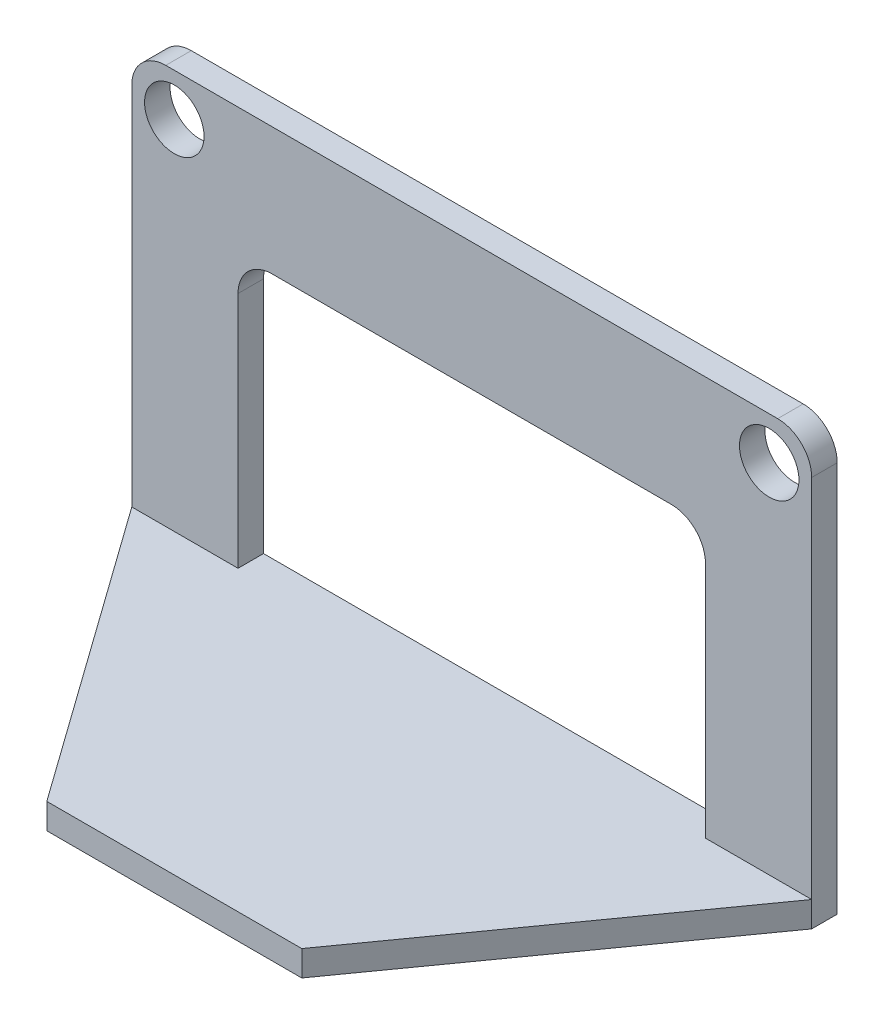
ISO-10303-21;
HEADER;
FILE_DESCRIPTION(('STEP AP214'),'2;1');
FILE_NAME('part.step','',(''),(''),'','','');
FILE_SCHEMA(('AUTOMOTIVE_DESIGN { 1 0 10303 214 1 1 1 1 }'));
ENDSEC;
DATA;
#1=APPLICATION_CONTEXT('core data for automotive mechanical design processes');
#2=APPLICATION_PROTOCOL_DEFINITION('international standard','automotive_design',2000,#1);
#3=PRODUCT_CONTEXT('',#1,'mechanical');
#4=PRODUCT('Part','Part','',(#3));
#5=PRODUCT_RELATED_PRODUCT_CATEGORY('part','',(#4));
#6=PRODUCT_DEFINITION_FORMATION('','',#4);
#7=PRODUCT_DEFINITION_CONTEXT('part definition',#1,'design');
#8=PRODUCT_DEFINITION('design','',#6,#7);
#9=PRODUCT_DEFINITION_SHAPE('','',#8);
#10=(LENGTH_UNIT() NAMED_UNIT(*) SI_UNIT(.MILLI.,.METRE.));
#11=(NAMED_UNIT(*) PLANE_ANGLE_UNIT() SI_UNIT($,.RADIAN.));
#12=(NAMED_UNIT(*) SI_UNIT($,.STERADIAN.) SOLID_ANGLE_UNIT());
#13=UNCERTAINTY_MEASURE_WITH_UNIT(LENGTH_MEASURE(1.E-05),#10,'distance_accuracy_value','');
#14=(GEOMETRIC_REPRESENTATION_CONTEXT(3) GLOBAL_UNCERTAINTY_ASSIGNED_CONTEXT((#13)) GLOBAL_UNIT_ASSIGNED_CONTEXT((#10,
#11,#12)) REPRESENTATION_CONTEXT('',''));
#15=CARTESIAN_POINT('',(0.,0.,0.));
#16=DIRECTION('',(0.,0.,1.));
#17=DIRECTION('',(1.,0.,0.));
#18=AXIS2_PLACEMENT_3D('',#15,#16,#17);
#19=CARTESIAN_POINT('',(0.,0.,3.));
#20=DIRECTION('',(0.,0.,-1.));
#21=DIRECTION('',(-1.,0.,0.));
#22=AXIS2_PLACEMENT_3D('',#19,#20,#21);
#23=PLANE('',#22);
#24=CARTESIAN_POINT('',(5.,-5.,3.));
#25=DIRECTION('',(0.,0.,1.));
#26=DIRECTION('',(1.,0.,0.));
#27=AXIS2_PLACEMENT_3D('',#24,#25,#26);
#28=CIRCLE('',#27,3.5);
#29=CARTESIAN_POINT('',(8.5,-5.,3.));
#30=VERTEX_POINT('',#29);
#31=EDGE_CURVE('E208',#30,#30,#28,.T.);
#32=ORIENTED_EDGE('',*,*,#31,.F.);
#33=EDGE_LOOP('',(#32));
#34=FACE_BOUND('',#33,.T.);
#35=CARTESIAN_POINT('',(75.,-5.,3.));
#36=DIRECTION('',(0.,0.,1.));
#37=DIRECTION('',(1.,0.,0.));
#38=AXIS2_PLACEMENT_3D('',#35,#36,#37);
#39=CIRCLE('',#38,3.50000000000001);
#40=CARTESIAN_POINT('',(78.5,-5.,3.));
#41=VERTEX_POINT('',#40);
#42=EDGE_CURVE('E201',#41,#41,#39,.T.);
#43=ORIENTED_EDGE('',*,*,#42,.F.);
#44=EDGE_LOOP('',(#43));
#45=FACE_BOUND('',#44,.T.);
#46=DIRECTION('',(-1.,0.,0.));
#47=VECTOR('',#46,1.);
#48=CARTESIAN_POINT('',(0.,-47.,3.));
#49=LINE('',#48,#47);
#50=CARTESIAN_POINT('',(80.,-47.,3.));
#51=VERTEX_POINT('',#50);
#52=CARTESIAN_POINT('',(67.5,-47.,3.));
#53=VERTEX_POINT('',#52);
#54=EDGE_CURVE('E157',#51,#53,#49,.T.);
#55=ORIENTED_EDGE('',*,*,#54,.F.);
#56=DIRECTION('',(0.,1.,0.));
#57=VECTOR('',#56,1.);
#58=CARTESIAN_POINT('',(80.,0.,3.));
#59=LINE('',#58,#57);
#60=CARTESIAN_POINT('',(80.,-4.,3.));
#61=VERTEX_POINT('',#60);
#62=EDGE_CURVE('E143',#51,#61,#59,.T.);
#63=ORIENTED_EDGE('',*,*,#62,.T.);
#64=CARTESIAN_POINT('',(76.,-4.,3.));
#65=DIRECTION('',(0.,0.,-1.));
#66=DIRECTION('',(-1.,0.,0.));
#67=AXIS2_PLACEMENT_3D('',#64,#65,#66);
#68=CIRCLE('',#67,4.);
#69=CARTESIAN_POINT('',(76.,0.,3.));
#70=VERTEX_POINT('',#69);
#71=EDGE_CURVE('E260',#61,#70,#68,.F.);
#72=ORIENTED_EDGE('',*,*,#71,.T.);
#73=DIRECTION('',(-1.,0.,0.));
#74=VECTOR('',#73,1.);
#75=CARTESIAN_POINT('',(0.,0.,3.));
#76=LINE('',#75,#74);
#77=CARTESIAN_POINT('',(4.,0.,3.));
#78=VERTEX_POINT('',#77);
#79=EDGE_CURVE('E171',#70,#78,#76,.T.);
#80=ORIENTED_EDGE('',*,*,#79,.T.);
#81=CARTESIAN_POINT('',(4.,-4.,3.));
#82=DIRECTION('',(0.,0.,-1.));
#83=DIRECTION('',(-1.,0.,0.));
#84=AXIS2_PLACEMENT_3D('',#81,#82,#83);
#85=CIRCLE('',#84,4.);
#86=CARTESIAN_POINT('',(0.,-4.,3.));
#87=VERTEX_POINT('',#86);
#88=EDGE_CURVE('E251',#78,#87,#85,.F.);
#89=ORIENTED_EDGE('',*,*,#88,.T.);
#90=DIRECTION('',(0.,-1.,0.));
#91=VECTOR('',#90,1.);
#92=CARTESIAN_POINT('',(0.,-50.,3.));
#93=LINE('',#92,#91);
#94=CARTESIAN_POINT('',(0.,-47.,3.));
#95=VERTEX_POINT('',#94);
#96=EDGE_CURVE('E214',#87,#95,#93,.T.);
#97=ORIENTED_EDGE('',*,*,#96,.T.);
#98=CARTESIAN_POINT('',(12.5,-47.,3.));
#99=VERTEX_POINT('',#98);
#100=EDGE_CURVE('E58',#99,#95,#49,.T.);
#101=ORIENTED_EDGE('',*,*,#100,.F.);
#102=DIRECTION('',(0.,1.,0.));
#103=VECTOR('',#102,1.);
#104=CARTESIAN_POINT('',(12.5,-50.,3.));
#105=LINE('',#104,#103);
#106=CARTESIAN_POINT('',(12.5,-19.,3.));
#107=VERTEX_POINT('',#106);
#108=EDGE_CURVE('E216',#99,#107,#105,.T.);
#109=ORIENTED_EDGE('',*,*,#108,.T.);
#110=CARTESIAN_POINT('',(16.5,-19.,3.));
#111=DIRECTION('',(0.,0.,-1.));
#112=DIRECTION('',(-1.,0.,0.));
#113=AXIS2_PLACEMENT_3D('',#110,#111,#112);
#114=CIRCLE('',#113,4.);
#115=CARTESIAN_POINT('',(16.5,-15.,3.));
#116=VERTEX_POINT('',#115);
#117=EDGE_CURVE('E270',#116,#107,#114,.F.);
#118=ORIENTED_EDGE('',*,*,#117,.F.);
#119=DIRECTION('',(1.,0.,0.));
#120=VECTOR('',#119,1.);
#121=CARTESIAN_POINT('',(12.5,-15.,3.));
#122=LINE('',#121,#120);
#123=CARTESIAN_POINT('',(63.5,-15.,3.));
#124=VERTEX_POINT('',#123);
#125=EDGE_CURVE('E219',#116,#124,#122,.T.);
#126=ORIENTED_EDGE('',*,*,#125,.T.);
#127=CARTESIAN_POINT('',(63.5,-19.,3.));
#128=DIRECTION('',(0.,0.,-1.));
#129=DIRECTION('',(-1.,0.,0.));
#130=AXIS2_PLACEMENT_3D('',#127,#128,#129);
#131=CIRCLE('',#130,4.);
#132=CARTESIAN_POINT('',(67.5,-19.,3.));
#133=VERTEX_POINT('',#132);
#134=EDGE_CURVE('E12',#133,#124,#131,.F.);
#135=ORIENTED_EDGE('',*,*,#134,.F.);
#136=DIRECTION('',(0.,-1.,0.));
#137=VECTOR('',#136,1.);
#138=CARTESIAN_POINT('',(67.5,-15.,3.));
#139=LINE('',#138,#137);
#140=EDGE_CURVE('E153',#133,#53,#139,.T.);
#141=ORIENTED_EDGE('',*,*,#140,.T.);
#142=EDGE_LOOP('',(#55,#63,#72,#80,#89,#97,#101,#109,#118,#126,#135,#141));
#143=FACE_BOUND('',#142,.T.);
#144=ADVANCED_FACE('F36',(#34,#45,#143),#23,.F.);
#145=CARTESIAN_POINT('',(12.5,-50.,3.));
#146=DIRECTION('',(-1.,0.,0.));
#147=DIRECTION('',(0.,0.,1.));
#148=AXIS2_PLACEMENT_3D('',#145,#146,#147);
#149=PLANE('',#148);
#150=DIRECTION('',(0.,0.,1.));
#151=VECTOR('',#150,1.);
#152=CARTESIAN_POINT('',(12.5,-47.,3.));
#153=LINE('',#152,#151);
#154=CARTESIAN_POINT('',(12.5,-47.,0.));
#155=VERTEX_POINT('',#154);
#156=EDGE_CURVE('E162',#155,#99,#153,.T.);
#157=ORIENTED_EDGE('',*,*,#156,.F.);
#158=DIRECTION('',(0.,1.,0.));
#159=VECTOR('',#158,1.);
#160=CARTESIAN_POINT('',(12.5,-50.,0.));
#161=LINE('',#160,#159);
#162=CARTESIAN_POINT('',(12.5,-19.,0.));
#163=VERTEX_POINT('',#162);
#164=EDGE_CURVE('E226',#155,#163,#161,.T.);
#165=ORIENTED_EDGE('',*,*,#164,.T.);
#166=DIRECTION('',(0.,0.,1.));
#167=VECTOR('',#166,1.);
#168=CARTESIAN_POINT('',(12.5,-19.,3.));
#169=LINE('',#168,#167);
#170=EDGE_CURVE('E262',#163,#107,#169,.T.);
#171=ORIENTED_EDGE('',*,*,#170,.T.);
#172=ORIENTED_EDGE('',*,*,#108,.F.);
#173=EDGE_LOOP('',(#157,#165,#171,#172));
#174=FACE_BOUND('',#173,.T.);
#175=ADVANCED_FACE('F292',(#174),#149,.F.);
#176=CARTESIAN_POINT('',(67.5,-15.,3.));
#177=DIRECTION('',(1.,0.,0.));
#178=DIRECTION('',(0.,0.,-1.));
#179=AXIS2_PLACEMENT_3D('',#176,#177,#178);
#180=PLANE('',#179);
#181=DIRECTION('',(0.,0.,-1.));
#182=VECTOR('',#181,1.);
#183=CARTESIAN_POINT('',(67.5,-47.,3.));
#184=LINE('',#183,#182);
#185=CARTESIAN_POINT('',(67.5,-47.,0.));
#186=VERTEX_POINT('',#185);
#187=EDGE_CURVE('E163',#53,#186,#184,.T.);
#188=ORIENTED_EDGE('',*,*,#187,.F.);
#189=ORIENTED_EDGE('',*,*,#140,.F.);
#190=DIRECTION('',(0.,0.,1.));
#191=VECTOR('',#190,1.);
#192=CARTESIAN_POINT('',(67.5,-19.,3.));
#193=LINE('',#192,#191);
#194=CARTESIAN_POINT('',(67.5,-19.,0.));
#195=VERTEX_POINT('',#194);
#196=EDGE_CURVE('E276',#133,#195,#193,.F.);
#197=ORIENTED_EDGE('',*,*,#196,.T.);
#198=DIRECTION('',(0.,-1.,0.));
#199=VECTOR('',#198,1.);
#200=CARTESIAN_POINT('',(67.5,-15.,0.));
#201=LINE('',#200,#199);
#202=EDGE_CURVE('E231',#195,#186,#201,.T.);
#203=ORIENTED_EDGE('',*,*,#202,.T.);
#204=EDGE_LOOP('',(#188,#189,#197,#203));
#205=FACE_BOUND('',#204,.T.);
#206=ADVANCED_FACE('F285',(#205),#180,.F.);
#207=CARTESIAN_POINT('',(63.5,-19.,3.));
#208=DIRECTION('',(0.,0.,-1.));
#209=DIRECTION('',(-1.,0.,0.));
#210=AXIS2_PLACEMENT_3D('',#207,#208,#209);
#211=CYLINDRICAL_SURFACE('',#210,4.);
#212=DIRECTION('',(0.,0.,1.));
#213=VECTOR('',#212,1.);
#214=CARTESIAN_POINT('',(63.5,-15.,3.));
#215=LINE('',#214,#213);
#216=CARTESIAN_POINT('',(63.5,-15.,0.));
#217=VERTEX_POINT('',#216);
#218=EDGE_CURVE('E273',#217,#124,#215,.T.);
#219=ORIENTED_EDGE('',*,*,#218,.F.);
#220=CARTESIAN_POINT('',(63.5,-19.,0.));
#221=DIRECTION('',(0.,0.,-1.));
#222=DIRECTION('',(-1.,0.,0.));
#223=AXIS2_PLACEMENT_3D('',#220,#221,#222);
#224=CIRCLE('',#223,4.);
#225=EDGE_CURVE('E44',#217,#195,#224,.T.);
#226=ORIENTED_EDGE('',*,*,#225,.T.);
#227=ORIENTED_EDGE('',*,*,#196,.F.);
#228=ORIENTED_EDGE('',*,*,#134,.T.);
#229=EDGE_LOOP('',(#219,#226,#227,#228));
#230=FACE_BOUND('',#229,.T.);
#231=ADVANCED_FACE('F38',(#230),#211,.F.);
#232=CARTESIAN_POINT('',(16.5,-19.,3.));
#233=DIRECTION('',(0.,0.,-1.));
#234=DIRECTION('',(-1.,0.,0.));
#235=AXIS2_PLACEMENT_3D('',#232,#233,#234);
#236=CYLINDRICAL_SURFACE('',#235,4.);
#237=ORIENTED_EDGE('',*,*,#170,.F.);
#238=CARTESIAN_POINT('',(16.5,-19.,0.));
#239=DIRECTION('',(0.,0.,-1.));
#240=DIRECTION('',(-1.,0.,0.));
#241=AXIS2_PLACEMENT_3D('',#238,#239,#240);
#242=CIRCLE('',#241,4.);
#243=CARTESIAN_POINT('',(16.5,-15.,0.));
#244=VERTEX_POINT('',#243);
#245=EDGE_CURVE('E268',#163,#244,#242,.T.);
#246=ORIENTED_EDGE('',*,*,#245,.T.);
#247=DIRECTION('',(0.,0.,1.));
#248=VECTOR('',#247,1.);
#249=CARTESIAN_POINT('',(16.5,-15.,3.));
#250=LINE('',#249,#248);
#251=EDGE_CURVE('E265',#116,#244,#250,.F.);
#252=ORIENTED_EDGE('',*,*,#251,.F.);
#253=ORIENTED_EDGE('',*,*,#117,.T.);
#254=EDGE_LOOP('',(#237,#246,#252,#253));
#255=FACE_BOUND('',#254,.T.);
#256=ADVANCED_FACE('F296',(#255),#236,.F.);
#257=CARTESIAN_POINT('',(76.,-4.,3.));
#258=DIRECTION('',(0.,0.,1.));
#259=DIRECTION('',(1.,0.,0.));
#260=AXIS2_PLACEMENT_3D('',#257,#258,#259);
#261=CYLINDRICAL_SURFACE('',#260,4.);
#262=DIRECTION('',(0.,0.,1.));
#263=VECTOR('',#262,1.);
#264=CARTESIAN_POINT('',(80.,-4.,3.));
#265=LINE('',#264,#263);
#266=CARTESIAN_POINT('',(80.,-4.,0.));
#267=VERTEX_POINT('',#266);
#268=EDGE_CURVE('E151',#267,#61,#265,.T.);
#269=ORIENTED_EDGE('',*,*,#268,.F.);
#270=CARTESIAN_POINT('',(76.,-4.,0.));
#271=DIRECTION('',(0.,0.,-1.));
#272=DIRECTION('',(-1.,0.,0.));
#273=AXIS2_PLACEMENT_3D('',#270,#271,#272);
#274=CIRCLE('',#273,4.);
#275=CARTESIAN_POINT('',(76.,0.,0.));
#276=VERTEX_POINT('',#275);
#277=EDGE_CURVE('E257',#276,#267,#274,.T.);
#278=ORIENTED_EDGE('',*,*,#277,.F.);
#279=DIRECTION('',(0.,0.,1.));
#280=VECTOR('',#279,1.);
#281=CARTESIAN_POINT('',(76.,0.,3.));
#282=LINE('',#281,#280);
#283=EDGE_CURVE('E254',#70,#276,#282,.F.);
#284=ORIENTED_EDGE('',*,*,#283,.F.);
#285=ORIENTED_EDGE('',*,*,#71,.F.);
#286=EDGE_LOOP('',(#269,#278,#284,#285));
#287=FACE_BOUND('',#286,.T.);
#288=ADVANCED_FACE('F340',(#287),#261,.T.);
#289=CARTESIAN_POINT('',(4.,-4.,3.));
#290=DIRECTION('',(0.,0.,1.));
#291=DIRECTION('',(1.,0.,0.));
#292=AXIS2_PLACEMENT_3D('',#289,#290,#291);
#293=CYLINDRICAL_SURFACE('',#292,4.);
#294=DIRECTION('',(0.,0.,1.));
#295=VECTOR('',#294,1.);
#296=CARTESIAN_POINT('',(4.,0.,3.));
#297=LINE('',#296,#295);
#298=CARTESIAN_POINT('',(4.,0.,0.));
#299=VERTEX_POINT('',#298);
#300=EDGE_CURVE('E242',#299,#78,#297,.T.);
#301=ORIENTED_EDGE('',*,*,#300,.F.);
#302=CARTESIAN_POINT('',(4.,-4.,0.));
#303=DIRECTION('',(0.,0.,-1.));
#304=DIRECTION('',(-1.,0.,0.));
#305=AXIS2_PLACEMENT_3D('',#302,#303,#304);
#306=CIRCLE('',#305,4.);
#307=CARTESIAN_POINT('',(0.,-4.,0.));
#308=VERTEX_POINT('',#307);
#309=EDGE_CURVE('E248',#308,#299,#306,.T.);
#310=ORIENTED_EDGE('',*,*,#309,.F.);
#311=DIRECTION('',(0.,0.,1.));
#312=VECTOR('',#311,1.);
#313=CARTESIAN_POINT('',(0.,-4.,3.));
#314=LINE('',#313,#312);
#315=EDGE_CURVE('E245',#87,#308,#314,.F.);
#316=ORIENTED_EDGE('',*,*,#315,.F.);
#317=ORIENTED_EDGE('',*,*,#88,.F.);
#318=EDGE_LOOP('',(#301,#310,#316,#317));
#319=FACE_BOUND('',#318,.T.);
#320=ADVANCED_FACE('F327',(#319),#293,.T.);
#321=CARTESIAN_POINT('',(0.,0.,0.));
#322=DIRECTION('',(0.,0.,-1.));
#323=DIRECTION('',(-1.,0.,0.));
#324=AXIS2_PLACEMENT_3D('',#321,#322,#323);
#325=PLANE('',#324);
#326=DIRECTION('',(1.,0.,0.));
#327=VECTOR('',#326,1.);
#328=CARTESIAN_POINT('',(0.,-47.,0.));
#329=LINE('',#328,#327);
#330=EDGE_CURVE('E178',#155,#186,#329,.T.);
#331=ORIENTED_EDGE('',*,*,#330,.T.);
#332=ORIENTED_EDGE('',*,*,#202,.F.);
#333=ORIENTED_EDGE('',*,*,#225,.F.);
#334=DIRECTION('',(1.,0.,0.));
#335=VECTOR('',#334,1.);
#336=CARTESIAN_POINT('',(12.5,-15.,0.));
#337=LINE('',#336,#335);
#338=EDGE_CURVE('E228',#244,#217,#337,.T.);
#339=ORIENTED_EDGE('',*,*,#338,.F.);
#340=ORIENTED_EDGE('',*,*,#245,.F.);
#341=ORIENTED_EDGE('',*,*,#164,.F.);
#342=EDGE_LOOP('',(#331,#332,#333,#339,#340,#341));
#343=FACE_BOUND('',#342,.T.);
#344=DIRECTION('',(1.,0.,0.));
#345=VECTOR('',#344,1.);
#346=CARTESIAN_POINT('',(80.,-50.,0.));
#347=LINE('',#346,#345);
#348=CARTESIAN_POINT('',(0.,-50.,0.));
#349=VERTEX_POINT('',#348);
#350=CARTESIAN_POINT('',(80.,-50.,0.));
#351=VERTEX_POINT('',#350);
#352=EDGE_CURVE('E233',#349,#351,#347,.T.);
#353=ORIENTED_EDGE('',*,*,#352,.F.);
#354=DIRECTION('',(0.,-1.,0.));
#355=VECTOR('',#354,1.);
#356=CARTESIAN_POINT('',(0.,-50.,0.));
#357=LINE('',#356,#355);
#358=EDGE_CURVE('E211',#308,#349,#357,.T.);
#359=ORIENTED_EDGE('',*,*,#358,.F.);
#360=ORIENTED_EDGE('',*,*,#309,.T.);
#361=DIRECTION('',(-1.,0.,0.));
#362=VECTOR('',#361,1.);
#363=CARTESIAN_POINT('',(0.,0.,0.));
#364=LINE('',#363,#362);
#365=EDGE_CURVE('E217',#276,#299,#364,.T.);
#366=ORIENTED_EDGE('',*,*,#365,.F.);
#367=ORIENTED_EDGE('',*,*,#277,.T.);
#368=DIRECTION('',(0.,1.,0.));
#369=VECTOR('',#368,1.);
#370=CARTESIAN_POINT('',(80.,0.,0.));
#371=LINE('',#370,#369);
#372=EDGE_CURVE('E235',#351,#267,#371,.T.);
#373=ORIENTED_EDGE('',*,*,#372,.F.);
#374=EDGE_LOOP('',(#353,#359,#360,#366,#367,#373));
#375=FACE_BOUND('',#374,.T.);
#376=CARTESIAN_POINT('',(5.,-5.,0.));
#377=DIRECTION('',(0.,0.,1.));
#378=DIRECTION('',(1.,0.,0.));
#379=AXIS2_PLACEMENT_3D('',#376,#377,#378);
#380=CIRCLE('',#379,3.5);
#381=CARTESIAN_POINT('',(8.5,-5.,0.));
#382=VERTEX_POINT('',#381);
#383=EDGE_CURVE('E204',#382,#382,#380,.T.);
#384=ORIENTED_EDGE('',*,*,#383,.T.);
#385=EDGE_LOOP('',(#384));
#386=FACE_BOUND('',#385,.T.);
#387=CARTESIAN_POINT('',(75.,-5.,0.));
#388=DIRECTION('',(0.,0.,1.));
#389=DIRECTION('',(1.,0.,0.));
#390=AXIS2_PLACEMENT_3D('',#387,#388,#389);
#391=CIRCLE('',#390,3.50000000000001);
#392=CARTESIAN_POINT('',(78.5,-5.,0.));
#393=VERTEX_POINT('',#392);
#394=EDGE_CURVE('E205',#393,#393,#391,.T.);
#395=ORIENTED_EDGE('',*,*,#394,.T.);
#396=EDGE_LOOP('',(#395));
#397=FACE_BOUND('',#396,.T.);
#398=ADVANCED_FACE('F286',(#343,#375,#386,#397),#325,.T.);
#399=CARTESIAN_POINT('',(0.,-50.,3.));
#400=DIRECTION('',(1.,0.,0.));
#401=DIRECTION('',(0.,0.,-1.));
#402=AXIS2_PLACEMENT_3D('',#399,#400,#401);
#403=PLANE('',#402);
#404=DIRECTION('',(0.,-1.,0.));
#405=VECTOR('',#404,1.);
#406=CARTESIAN_POINT('',(0.,-47.,3.));
#407=LINE('',#406,#405);
#408=CARTESIAN_POINT('',(0.,-50.,3.));
#409=VERTEX_POINT('',#408);
#410=EDGE_CURVE('E51',#95,#409,#407,.T.);
#411=ORIENTED_EDGE('',*,*,#410,.F.);
#412=ORIENTED_EDGE('',*,*,#96,.F.);
#413=ORIENTED_EDGE('',*,*,#315,.T.);
#414=ORIENTED_EDGE('',*,*,#358,.T.);
#415=DIRECTION('',(0.,0.,-1.));
#416=VECTOR('',#415,1.);
#417=CARTESIAN_POINT('',(0.,-50.,3.));
#418=LINE('',#417,#416);
#419=EDGE_CURVE('E239',#409,#349,#418,.T.);
#420=ORIENTED_EDGE('',*,*,#419,.F.);
#421=EDGE_LOOP('',(#411,#412,#413,#414,#420));
#422=FACE_BOUND('',#421,.T.);
#423=ADVANCED_FACE('F302',(#422),#403,.F.);
#424=CARTESIAN_POINT('',(12.5,-15.,3.));
#425=DIRECTION('',(0.,1.,0.));
#426=DIRECTION('',(0.,0.,1.));
#427=AXIS2_PLACEMENT_3D('',#424,#425,#426);
#428=PLANE('',#427);
#429=ORIENTED_EDGE('',*,*,#338,.T.);
#430=ORIENTED_EDGE('',*,*,#218,.T.);
#431=ORIENTED_EDGE('',*,*,#125,.F.);
#432=ORIENTED_EDGE('',*,*,#251,.T.);
#433=EDGE_LOOP('',(#429,#430,#431,#432));
#434=FACE_BOUND('',#433,.T.);
#435=ADVANCED_FACE('F299',(#434),#428,.F.);
#436=CARTESIAN_POINT('',(80.,-50.,3.));
#437=DIRECTION('',(0.,1.,0.));
#438=DIRECTION('',(0.,0.,1.));
#439=AXIS2_PLACEMENT_3D('',#436,#437,#438);
#440=PLANE('',#439);
#441=DIRECTION('',(0.,0.,-1.));
#442=VECTOR('',#441,1.);
#443=CARTESIAN_POINT('',(80.,-50.,3.));
#444=LINE('',#443,#442);
#445=CARTESIAN_POINT('',(80.,-50.,3.));
#446=VERTEX_POINT('',#445);
#447=EDGE_CURVE('E224',#446,#351,#444,.T.);
#448=ORIENTED_EDGE('',*,*,#447,.F.);
#449=DIRECTION('',(-0.581238193719096,0.,0.813733471206735));
#450=VECTOR('',#449,1.);
#451=CARTESIAN_POINT('',(55.,-50.,38.));
#452=LINE('',#451,#450);
#453=CARTESIAN_POINT('',(55.,-50.,38.));
#454=VERTEX_POINT('',#453);
#455=EDGE_CURVE('E170',#446,#454,#452,.T.);
#456=ORIENTED_EDGE('',*,*,#455,.T.);
#457=DIRECTION('',(-1.,0.,0.));
#458=VECTOR('',#457,1.);
#459=CARTESIAN_POINT('',(25.,-50.,38.));
#460=LINE('',#459,#458);
#461=CARTESIAN_POINT('',(25.,-50.,38.));
#462=VERTEX_POINT('',#461);
#463=EDGE_CURVE('E190',#454,#462,#460,.T.);
#464=ORIENTED_EDGE('',*,*,#463,.T.);
#465=DIRECTION('',(-0.581238193719096,0.,-0.813733471206735));
#466=VECTOR('',#465,1.);
#467=CARTESIAN_POINT('',(0.,-50.,3.));
#468=LINE('',#467,#466);
#469=EDGE_CURVE('E183',#462,#409,#468,.T.);
#470=ORIENTED_EDGE('',*,*,#469,.T.);
#471=ORIENTED_EDGE('',*,*,#419,.T.);
#472=ORIENTED_EDGE('',*,*,#352,.T.);
#473=EDGE_LOOP('',(#448,#456,#464,#470,#471,#472));
#474=FACE_BOUND('',#473,.T.);
#475=ADVANCED_FACE('F301',(#474),#440,.F.);
#476=CARTESIAN_POINT('',(80.,0.,3.));
#477=DIRECTION('',(-1.,0.,0.));
#478=DIRECTION('',(0.,0.,1.));
#479=AXIS2_PLACEMENT_3D('',#476,#477,#478);
#480=PLANE('',#479);
#481=ORIENTED_EDGE('',*,*,#372,.T.);
#482=ORIENTED_EDGE('',*,*,#268,.T.);
#483=ORIENTED_EDGE('',*,*,#62,.F.);
#484=EDGE_CURVE('E148',#446,#51,#59,.T.);
#485=ORIENTED_EDGE('',*,*,#484,.F.);
#486=ORIENTED_EDGE('',*,*,#447,.T.);
#487=EDGE_LOOP('',(#481,#482,#483,#485,#486));
#488=FACE_BOUND('',#487,.T.);
#489=ADVANCED_FACE('F145',(#488),#480,.F.);
#490=CARTESIAN_POINT('',(0.,0.,3.));
#491=DIRECTION('',(0.,-1.,0.));
#492=DIRECTION('',(0.,0.,-1.));
#493=AXIS2_PLACEMENT_3D('',#490,#491,#492);
#494=PLANE('',#493);
#495=ORIENTED_EDGE('',*,*,#79,.F.);
#496=ORIENTED_EDGE('',*,*,#283,.T.);
#497=ORIENTED_EDGE('',*,*,#365,.T.);
#498=ORIENTED_EDGE('',*,*,#300,.T.);
#499=EDGE_LOOP('',(#495,#496,#497,#498));
#500=FACE_BOUND('',#499,.T.);
#501=ADVANCED_FACE('F328',(#500),#494,.F.);
#502=CARTESIAN_POINT('',(5.,-5.,3.));
#503=DIRECTION('',(0.,0.,-1.));
#504=DIRECTION('',(-1.,0.,0.));
#505=AXIS2_PLACEMENT_3D('',#502,#503,#504);
#506=CYLINDRICAL_SURFACE('',#505,3.5);
#507=ORIENTED_EDGE('',*,*,#31,.T.);
#508=EDGE_LOOP('',(#507));
#509=FACE_BOUND('',#508,.T.);
#510=ORIENTED_EDGE('',*,*,#383,.F.);
#511=EDGE_LOOP('',(#510));
#512=FACE_BOUND('',#511,.T.);
#513=ADVANCED_FACE('F323',(#509,#512),#506,.F.);
#514=CARTESIAN_POINT('',(75.,-5.,3.));
#515=DIRECTION('',(0.,0.,-1.));
#516=DIRECTION('',(-1.,0.,0.));
#517=AXIS2_PLACEMENT_3D('',#514,#515,#516);
#518=CYLINDRICAL_SURFACE('',#517,3.50000000000001);
#519=ORIENTED_EDGE('',*,*,#42,.T.);
#520=EDGE_LOOP('',(#519));
#521=FACE_BOUND('',#520,.T.);
#522=ORIENTED_EDGE('',*,*,#394,.F.);
#523=EDGE_LOOP('',(#522));
#524=FACE_BOUND('',#523,.T.);
#525=ADVANCED_FACE('F376',(#521,#524),#518,.F.);
#526=CARTESIAN_POINT('',(0.,-47.,0.));
#527=DIRECTION('',(0.,-1.,0.));
#528=DIRECTION('',(0.,0.,-1.));
#529=AXIS2_PLACEMENT_3D('',#526,#527,#528);
#530=PLANE('',#529);
#531=ORIENTED_EDGE('',*,*,#156,.T.);
#532=ORIENTED_EDGE('',*,*,#100,.T.);
#533=DIRECTION('',(-0.581238193719096,0.,-0.813733471206735));
#534=VECTOR('',#533,1.);
#535=CARTESIAN_POINT('',(0.,-47.,3.));
#536=LINE('',#535,#534);
#537=CARTESIAN_POINT('',(25.,-47.,38.));
#538=VERTEX_POINT('',#537);
#539=EDGE_CURVE('E180',#538,#95,#536,.T.);
#540=ORIENTED_EDGE('',*,*,#539,.F.);
#541=DIRECTION('',(-1.,0.,0.));
#542=VECTOR('',#541,1.);
#543=CARTESIAN_POINT('',(25.,-47.,38.));
#544=LINE('',#543,#542);
#545=CARTESIAN_POINT('',(55.,-47.,38.));
#546=VERTEX_POINT('',#545);
#547=EDGE_CURVE('E177',#546,#538,#544,.T.);
#548=ORIENTED_EDGE('',*,*,#547,.F.);
#549=DIRECTION('',(-0.581238193719096,0.,0.813733471206735));
#550=VECTOR('',#549,1.);
#551=CARTESIAN_POINT('',(55.,-47.,38.));
#552=LINE('',#551,#550);
#553=EDGE_CURVE('E168',#51,#546,#552,.T.);
#554=ORIENTED_EDGE('',*,*,#553,.F.);
#555=ORIENTED_EDGE('',*,*,#54,.T.);
#556=ORIENTED_EDGE('',*,*,#187,.T.);
#557=ORIENTED_EDGE('',*,*,#330,.F.);
#558=EDGE_LOOP('',(#531,#532,#540,#548,#554,#555,#556,#557));
#559=FACE_BOUND('',#558,.T.);
#560=ADVANCED_FACE('F174',(#559),#530,.F.);
#561=CARTESIAN_POINT('',(0.,-47.,3.));
#562=DIRECTION('',(-0.813733471206735,0.,0.581238193719096));
#563=DIRECTION('',(0.581238193719096,0.,0.813733471206735));
#564=AXIS2_PLACEMENT_3D('',#561,#562,#563);
#565=PLANE('',#564);
#566=ORIENTED_EDGE('',*,*,#469,.F.);
#567=DIRECTION('',(0.,-1.,0.));
#568=VECTOR('',#567,1.);
#569=CARTESIAN_POINT('',(25.,-47.,38.));
#570=LINE('',#569,#568);
#571=EDGE_CURVE('E196',#538,#462,#570,.T.);
#572=ORIENTED_EDGE('',*,*,#571,.F.);
#573=ORIENTED_EDGE('',*,*,#539,.T.);
#574=ORIENTED_EDGE('',*,*,#410,.T.);
#575=EDGE_LOOP('',(#566,#572,#573,#574));
#576=FACE_BOUND('',#575,.T.);
#577=ADVANCED_FACE('F364',(#576),#565,.T.);
#578=CARTESIAN_POINT('',(25.,-47.,38.));
#579=DIRECTION('',(0.,0.,1.));
#580=DIRECTION('',(1.,0.,0.));
#581=AXIS2_PLACEMENT_3D('',#578,#579,#580);
#582=PLANE('',#581);
#583=ORIENTED_EDGE('',*,*,#463,.F.);
#584=DIRECTION('',(0.,-1.,0.));
#585=VECTOR('',#584,1.);
#586=CARTESIAN_POINT('',(55.,-47.,38.));
#587=LINE('',#586,#585);
#588=EDGE_CURVE('E188',#546,#454,#587,.T.);
#589=ORIENTED_EDGE('',*,*,#588,.F.);
#590=ORIENTED_EDGE('',*,*,#547,.T.);
#591=ORIENTED_EDGE('',*,*,#571,.T.);
#592=EDGE_LOOP('',(#583,#589,#590,#591));
#593=FACE_BOUND('',#592,.T.);
#594=ADVANCED_FACE('F366',(#593),#582,.T.);
#595=CARTESIAN_POINT('',(55.,-47.,38.));
#596=DIRECTION('',(0.813733471206735,0.,0.581238193719096));
#597=DIRECTION('',(0.581238193719096,0.,-0.813733471206735));
#598=AXIS2_PLACEMENT_3D('',#595,#596,#597);
#599=PLANE('',#598);
#600=ORIENTED_EDGE('',*,*,#455,.F.);
#601=ORIENTED_EDGE('',*,*,#484,.T.);
#602=ORIENTED_EDGE('',*,*,#553,.T.);
#603=ORIENTED_EDGE('',*,*,#588,.T.);
#604=EDGE_LOOP('',(#600,#601,#602,#603));
#605=FACE_BOUND('',#604,.T.);
#606=ADVANCED_FACE('F167',(#605),#599,.T.);
#607=CLOSED_SHELL('',(#144,#175,#206,#231,#256,#288,#320,#398,#423,#435,#475,#489,#501,#513,
#525,#560,#577,#594,#606));
#608=MANIFOLD_SOLID_BREP('B2',#607);
#609=ADVANCED_BREP_SHAPE_REPRESENTATION('',(#18,#608),#14);
#610=SHAPE_DEFINITION_REPRESENTATION(#9,#609);
ENDSEC;
END-ISO-10303-21;
